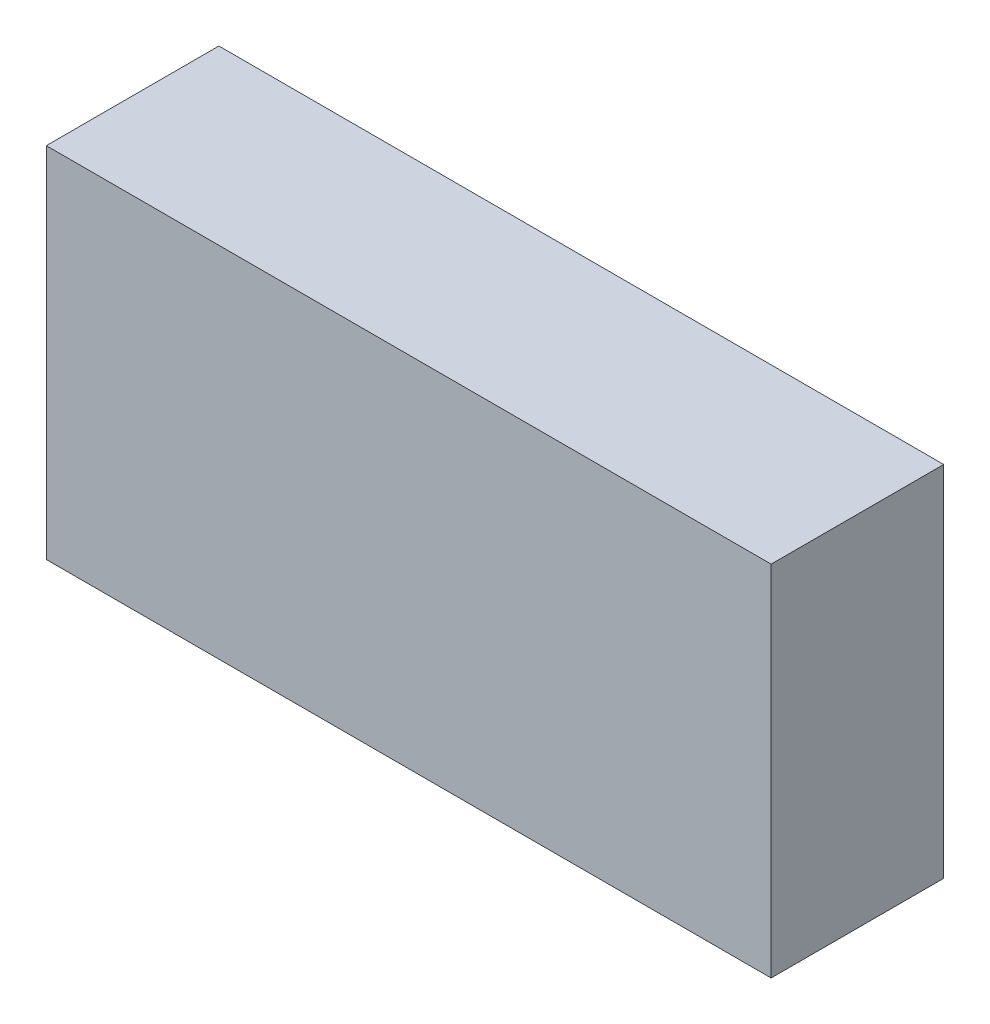
ISO-10303-21;
HEADER;
FILE_DESCRIPTION(('STEP AP214'),'2;1');
FILE_NAME('part.step','',(''),(''),'','','');
FILE_SCHEMA(('AUTOMOTIVE_DESIGN { 1 0 10303 214 1 1 1 1 }'));
ENDSEC;
DATA;
#1=APPLICATION_CONTEXT('core data for automotive mechanical design processes');
#2=APPLICATION_PROTOCOL_DEFINITION('international standard','automotive_design',2000,#1);
#3=PRODUCT_CONTEXT('',#1,'mechanical');
#4=PRODUCT('Part','Part','',(#3));
#5=PRODUCT_RELATED_PRODUCT_CATEGORY('part','',(#4));
#6=PRODUCT_DEFINITION_FORMATION('','',#4);
#7=PRODUCT_DEFINITION_CONTEXT('part definition',#1,'design');
#8=PRODUCT_DEFINITION('design','',#6,#7);
#9=PRODUCT_DEFINITION_SHAPE('','',#8);
#10=(LENGTH_UNIT() NAMED_UNIT(*) SI_UNIT(.MILLI.,.METRE.));
#11=(NAMED_UNIT(*) PLANE_ANGLE_UNIT() SI_UNIT($,.RADIAN.));
#12=(NAMED_UNIT(*) SI_UNIT($,.STERADIAN.) SOLID_ANGLE_UNIT());
#13=UNCERTAINTY_MEASURE_WITH_UNIT(LENGTH_MEASURE(1.E-05),#10,'distance_accuracy_value','');
#14=(GEOMETRIC_REPRESENTATION_CONTEXT(3) GLOBAL_UNCERTAINTY_ASSIGNED_CONTEXT((#13)) GLOBAL_UNIT_ASSIGNED_CONTEXT((#10,
#11,#12)) REPRESENTATION_CONTEXT('',''));
#15=CARTESIAN_POINT('',(0.,0.,0.));
#16=DIRECTION('',(0.,0.,1.));
#17=DIRECTION('',(1.,0.,0.));
#18=AXIS2_PLACEMENT_3D('',#15,#16,#17);
#19=CARTESIAN_POINT('',(1.365,0.675,0.65));
#20=DIRECTION('',(0.,-1.,0.));
#21=DIRECTION('',(0.,0.,-1.));
#22=AXIS2_PLACEMENT_3D('',#19,#20,#21);
#23=PLANE('',#22);
#24=DIRECTION('',(-1.,0.,0.));
#25=VECTOR('',#24,1.);
#26=CARTESIAN_POINT('',(1.365,0.675,0.));
#27=LINE('',#26,#25);
#28=CARTESIAN_POINT('',(1.365,0.675,0.));
#29=VERTEX_POINT('',#28);
#30=CARTESIAN_POINT('',(-1.365,0.675,0.));
#31=VERTEX_POINT('',#30);
#32=EDGE_CURVE('E97',#29,#31,#27,.T.);
#33=ORIENTED_EDGE('',*,*,#32,.T.);
#34=DIRECTION('',(0.,0.,-1.));
#35=VECTOR('',#34,1.);
#36=CARTESIAN_POINT('',(-1.365,0.675,0.65));
#37=LINE('',#36,#35);
#38=CARTESIAN_POINT('',(-1.365,0.675,0.65));
#39=VERTEX_POINT('',#38);
#40=EDGE_CURVE('E11',#39,#31,#37,.T.);
#41=ORIENTED_EDGE('',*,*,#40,.F.);
#42=DIRECTION('',(-1.,0.,0.));
#43=VECTOR('',#42,1.);
#44=CARTESIAN_POINT('',(1.365,0.675,0.65));
#45=LINE('',#44,#43);
#46=CARTESIAN_POINT('',(1.365,0.675,0.65));
#47=VERTEX_POINT('',#46);
#48=EDGE_CURVE('E85',#47,#39,#45,.T.);
#49=ORIENTED_EDGE('',*,*,#48,.F.);
#50=DIRECTION('',(0.,0.,-1.));
#51=VECTOR('',#50,1.);
#52=CARTESIAN_POINT('',(1.365,0.675,0.65));
#53=LINE('',#52,#51);
#54=EDGE_CURVE('E93',#47,#29,#53,.T.);
#55=ORIENTED_EDGE('',*,*,#54,.T.);
#56=EDGE_LOOP('',(#33,#41,#49,#55));
#57=FACE_BOUND('',#56,.T.);
#58=ADVANCED_FACE('F34',(#57),#23,.F.);
#59=CARTESIAN_POINT('',(-1.365,0.675,0.65));
#60=DIRECTION('',(1.,0.,0.));
#61=DIRECTION('',(0.,0.,-1.));
#62=AXIS2_PLACEMENT_3D('',#59,#60,#61);
#63=PLANE('',#62);
#64=DIRECTION('',(0.,-1.,0.));
#65=VECTOR('',#64,1.);
#66=CARTESIAN_POINT('',(-1.365,0.675,0.));
#67=LINE('',#66,#65);
#68=CARTESIAN_POINT('',(-1.365,-0.675,0.));
#69=VERTEX_POINT('',#68);
#70=EDGE_CURVE('E89',#31,#69,#67,.T.);
#71=ORIENTED_EDGE('',*,*,#70,.T.);
#72=DIRECTION('',(0.,0.,-1.));
#73=VECTOR('',#72,1.);
#74=CARTESIAN_POINT('',(-1.365,-0.675,0.65));
#75=LINE('',#74,#73);
#76=CARTESIAN_POINT('',(-1.365,-0.675,0.65));
#77=VERTEX_POINT('',#76);
#78=EDGE_CURVE('E42',#77,#69,#75,.T.);
#79=ORIENTED_EDGE('',*,*,#78,.F.);
#80=DIRECTION('',(0.,-1.,0.));
#81=VECTOR('',#80,1.);
#82=CARTESIAN_POINT('',(-1.365,0.675,0.65));
#83=LINE('',#82,#81);
#84=EDGE_CURVE('E80',#39,#77,#83,.T.);
#85=ORIENTED_EDGE('',*,*,#84,.F.);
#86=ORIENTED_EDGE('',*,*,#40,.T.);
#87=EDGE_LOOP('',(#71,#79,#85,#86));
#88=FACE_BOUND('',#87,.T.);
#89=ADVANCED_FACE('F88',(#88),#63,.F.);
#90=CARTESIAN_POINT('',(-1.365,-0.675,0.65));
#91=DIRECTION('',(0.,1.,0.));
#92=DIRECTION('',(0.,0.,1.));
#93=AXIS2_PLACEMENT_3D('',#90,#91,#92);
#94=PLANE('',#93);
#95=DIRECTION('',(1.,0.,0.));
#96=VECTOR('',#95,1.);
#97=CARTESIAN_POINT('',(-1.365,-0.675,0.));
#98=LINE('',#97,#96);
#99=CARTESIAN_POINT('',(1.365,-0.675,0.));
#100=VERTEX_POINT('',#99);
#101=EDGE_CURVE('E67',#69,#100,#98,.T.);
#102=ORIENTED_EDGE('',*,*,#101,.T.);
#103=DIRECTION('',(0.,0.,-1.));
#104=VECTOR('',#103,1.);
#105=CARTESIAN_POINT('',(1.365,-0.675,0.65));
#106=LINE('',#105,#104);
#107=CARTESIAN_POINT('',(1.365,-0.675,0.65));
#108=VERTEX_POINT('',#107);
#109=EDGE_CURVE('E90',#108,#100,#106,.T.);
#110=ORIENTED_EDGE('',*,*,#109,.F.);
#111=DIRECTION('',(1.,0.,0.));
#112=VECTOR('',#111,1.);
#113=CARTESIAN_POINT('',(-1.365,-0.675,0.65));
#114=LINE('',#113,#112);
#115=EDGE_CURVE('E83',#77,#108,#114,.T.);
#116=ORIENTED_EDGE('',*,*,#115,.F.);
#117=ORIENTED_EDGE('',*,*,#78,.T.);
#118=EDGE_LOOP('',(#102,#110,#116,#117));
#119=FACE_BOUND('',#118,.T.);
#120=ADVANCED_FACE('F91',(#119),#94,.F.);
#121=CARTESIAN_POINT('',(1.365,-0.675,0.65));
#122=DIRECTION('',(-1.,0.,0.));
#123=DIRECTION('',(0.,0.,1.));
#124=AXIS2_PLACEMENT_3D('',#121,#122,#123);
#125=PLANE('',#124);
#126=DIRECTION('',(0.,1.,0.));
#127=VECTOR('',#126,1.);
#128=CARTESIAN_POINT('',(1.365,-0.675,0.));
#129=LINE('',#128,#127);
#130=EDGE_CURVE('E73',#100,#29,#129,.T.);
#131=ORIENTED_EDGE('',*,*,#130,.T.);
#132=ORIENTED_EDGE('',*,*,#54,.F.);
#133=DIRECTION('',(0.,1.,0.));
#134=VECTOR('',#133,1.);
#135=CARTESIAN_POINT('',(1.365,-0.675,0.65));
#136=LINE('',#135,#134);
#137=EDGE_CURVE('E50',#108,#47,#136,.T.);
#138=ORIENTED_EDGE('',*,*,#137,.F.);
#139=ORIENTED_EDGE('',*,*,#109,.T.);
#140=EDGE_LOOP('',(#131,#132,#138,#139));
#141=FACE_BOUND('',#140,.T.);
#142=ADVANCED_FACE('F104',(#141),#125,.F.);
#143=CARTESIAN_POINT('',(0.,0.,0.65));
#144=DIRECTION('',(0.,0.,1.));
#145=DIRECTION('',(1.,0.,0.));
#146=AXIS2_PLACEMENT_3D('',#143,#144,#145);
#147=PLANE('',#146);
#148=ORIENTED_EDGE('',*,*,#48,.T.);
#149=ORIENTED_EDGE('',*,*,#84,.T.);
#150=ORIENTED_EDGE('',*,*,#115,.T.);
#151=ORIENTED_EDGE('',*,*,#137,.T.);
#152=EDGE_LOOP('',(#148,#149,#150,#151));
#153=FACE_BOUND('',#152,.T.);
#154=ADVANCED_FACE('F81',(#153),#147,.T.);
#155=CARTESIAN_POINT('',(0.,0.,0.));
#156=DIRECTION('',(0.,0.,1.));
#157=DIRECTION('',(1.,0.,0.));
#158=AXIS2_PLACEMENT_3D('',#155,#156,#157);
#159=PLANE('',#158);
#160=ORIENTED_EDGE('',*,*,#32,.F.);
#161=ORIENTED_EDGE('',*,*,#130,.F.);
#162=ORIENTED_EDGE('',*,*,#101,.F.);
#163=ORIENTED_EDGE('',*,*,#70,.F.);
#164=EDGE_LOOP('',(#160,#161,#162,#163));
#165=FACE_BOUND('',#164,.T.);
#166=ADVANCED_FACE('F107',(#165),#159,.F.);
#167=CLOSED_SHELL('',(#58,#89,#120,#142,#154,#166));
#168=MANIFOLD_SOLID_BREP('B2',#167);
#169=ADVANCED_BREP_SHAPE_REPRESENTATION('',(#18,#168),#14);
#170=SHAPE_DEFINITION_REPRESENTATION(#9,#169);
ENDSEC;
END-ISO-10303-21;
